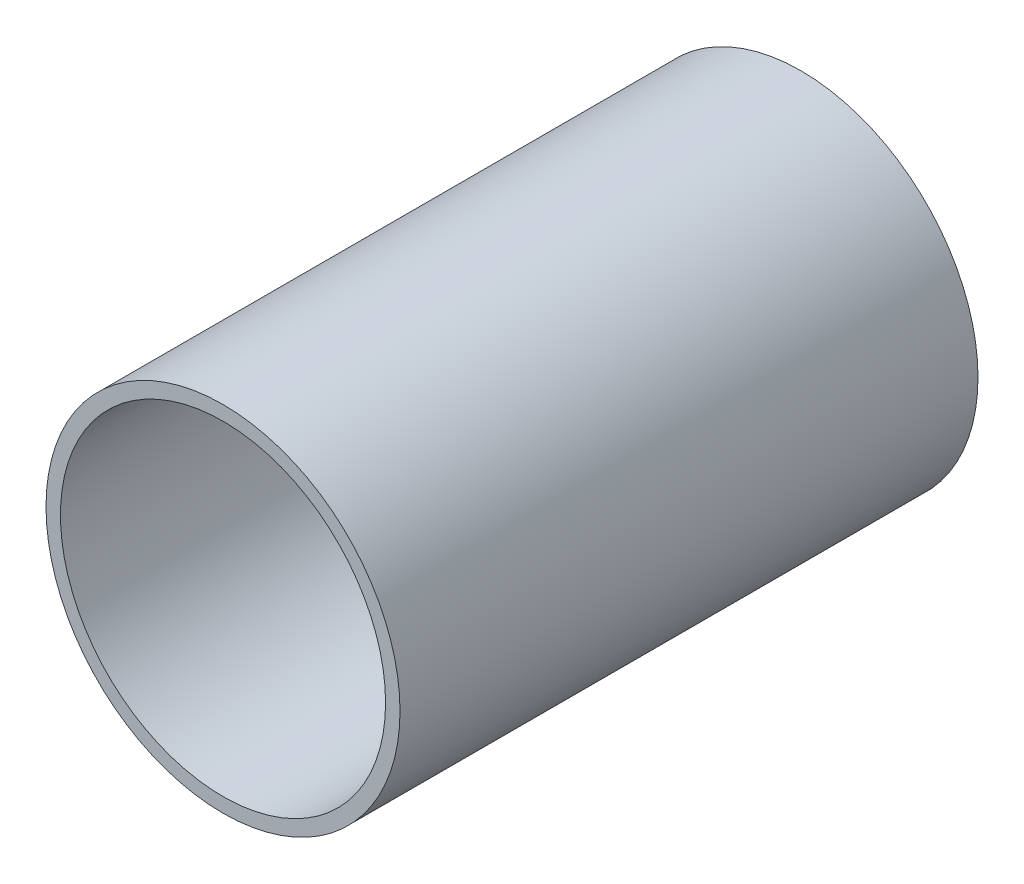
ISO-10303-21;
HEADER;
FILE_DESCRIPTION(('STEP AP214'),'2;1');
FILE_NAME('part.step','',(''),(''),'','','');
FILE_SCHEMA(('AUTOMOTIVE_DESIGN { 1 0 10303 214 1 1 1 1 }'));
ENDSEC;
DATA;
#1=APPLICATION_CONTEXT('core data for automotive mechanical design processes');
#2=APPLICATION_PROTOCOL_DEFINITION('international standard','automotive_design',2000,#1);
#3=PRODUCT_CONTEXT('',#1,'mechanical');
#4=PRODUCT('Part','Part','',(#3));
#5=PRODUCT_RELATED_PRODUCT_CATEGORY('part','',(#4));
#6=PRODUCT_DEFINITION_FORMATION('','',#4);
#7=PRODUCT_DEFINITION_CONTEXT('part definition',#1,'design');
#8=PRODUCT_DEFINITION('design','',#6,#7);
#9=PRODUCT_DEFINITION_SHAPE('','',#8);
#10=(LENGTH_UNIT() NAMED_UNIT(*) SI_UNIT(.MILLI.,.METRE.));
#11=(NAMED_UNIT(*) PLANE_ANGLE_UNIT() SI_UNIT($,.RADIAN.));
#12=(NAMED_UNIT(*) SI_UNIT($,.STERADIAN.) SOLID_ANGLE_UNIT());
#13=UNCERTAINTY_MEASURE_WITH_UNIT(LENGTH_MEASURE(1.E-05),#10,'distance_accuracy_value','');
#14=(GEOMETRIC_REPRESENTATION_CONTEXT(3) GLOBAL_UNCERTAINTY_ASSIGNED_CONTEXT((#13)) GLOBAL_UNIT_ASSIGNED_CONTEXT((#10,
#11,#12)) REPRESENTATION_CONTEXT('',''));
#15=CARTESIAN_POINT('',(0.,0.,0.));
#16=DIRECTION('',(0.,0.,1.));
#17=DIRECTION('',(1.,0.,0.));
#18=AXIS2_PLACEMENT_3D('',#15,#16,#17);
#19=CARTESIAN_POINT('',(11.1125,-19.05,25.4));
#20=DIRECTION('',(0.,0.,1.));
#21=DIRECTION('',(1.,0.,0.));
#22=AXIS2_PLACEMENT_3D('',#19,#20,#21);
#23=PLANE('',#22);
#24=CARTESIAN_POINT('',(11.1125,-19.05,25.4));
#25=DIRECTION('',(0.,0.,1.));
#26=DIRECTION('',(1.,0.,0.));
#27=AXIS2_PLACEMENT_3D('',#24,#25,#26);
#28=CIRCLE('',#27,15.5575);
#29=CARTESIAN_POINT('',(26.67,-19.05,25.4));
#30=VERTEX_POINT('',#29);
#31=EDGE_CURVE('E10',#30,#30,#28,.T.);
#32=ORIENTED_EDGE('',*,*,#31,.T.);
#33=EDGE_LOOP('',(#32));
#34=FACE_BOUND('',#33,.T.);
#35=CARTESIAN_POINT('',(11.1125,-19.05,25.4));
#36=DIRECTION('',(0.,0.,1.));
#37=DIRECTION('',(1.,0.,0.));
#38=AXIS2_PLACEMENT_3D('',#35,#36,#37);
#39=CIRCLE('',#38,14.2875);
#40=CARTESIAN_POINT('',(25.4,-19.05,25.4));
#41=VERTEX_POINT('',#40);
#42=EDGE_CURVE('E54',#41,#41,#39,.T.);
#43=ORIENTED_EDGE('',*,*,#42,.F.);
#44=EDGE_LOOP('',(#43));
#45=FACE_BOUND('',#44,.T.);
#46=ADVANCED_FACE('F41',(#34,#45),#23,.T.);
#47=CARTESIAN_POINT('',(11.1125,-19.05,-25.4));
#48=DIRECTION('',(0.,0.,1.));
#49=DIRECTION('',(1.,0.,0.));
#50=AXIS2_PLACEMENT_3D('',#47,#48,#49);
#51=PLANE('',#50);
#52=CARTESIAN_POINT('',(11.1125,-19.05,-25.4));
#53=DIRECTION('',(0.,0.,1.));
#54=DIRECTION('',(1.,0.,0.));
#55=AXIS2_PLACEMENT_3D('',#52,#53,#54);
#56=CIRCLE('',#55,15.5575);
#57=CARTESIAN_POINT('',(26.67,-19.05,-25.4));
#58=VERTEX_POINT('',#57);
#59=EDGE_CURVE('E45',#58,#58,#56,.T.);
#60=ORIENTED_EDGE('',*,*,#59,.F.);
#61=EDGE_LOOP('',(#60));
#62=FACE_BOUND('',#61,.T.);
#63=CARTESIAN_POINT('',(11.1125,-19.05,-25.4));
#64=DIRECTION('',(0.,0.,1.));
#65=DIRECTION('',(1.,0.,0.));
#66=AXIS2_PLACEMENT_3D('',#63,#64,#65);
#67=CIRCLE('',#66,14.2875);
#68=CARTESIAN_POINT('',(25.4,-19.05,-25.4));
#69=VERTEX_POINT('',#68);
#70=EDGE_CURVE('E56',#69,#69,#67,.T.);
#71=ORIENTED_EDGE('',*,*,#70,.T.);
#72=EDGE_LOOP('',(#71));
#73=FACE_BOUND('',#72,.T.);
#74=ADVANCED_FACE('F68',(#62,#73),#51,.F.);
#75=CARTESIAN_POINT('',(11.1125,-19.05,25.4));
#76=DIRECTION('',(0.,0.,-1.));
#77=DIRECTION('',(-1.,0.,0.));
#78=AXIS2_PLACEMENT_3D('',#75,#76,#77);
#79=CYLINDRICAL_SURFACE('',#78,15.5575);
#80=ORIENTED_EDGE('',*,*,#31,.F.);
#81=EDGE_LOOP('',(#80));
#82=FACE_BOUND('',#81,.T.);
#83=ORIENTED_EDGE('',*,*,#59,.T.);
#84=EDGE_LOOP('',(#83));
#85=FACE_BOUND('',#84,.T.);
#86=ADVANCED_FACE('F43',(#82,#85),#79,.T.);
#87=CARTESIAN_POINT('',(11.1125,-19.05,25.4));
#88=DIRECTION('',(0.,0.,-1.));
#89=DIRECTION('',(-1.,0.,0.));
#90=AXIS2_PLACEMENT_3D('',#87,#88,#89);
#91=CYLINDRICAL_SURFACE('',#90,14.2875);
#92=ORIENTED_EDGE('',*,*,#42,.T.);
#93=EDGE_LOOP('',(#92));
#94=FACE_BOUND('',#93,.T.);
#95=ORIENTED_EDGE('',*,*,#70,.F.);
#96=EDGE_LOOP('',(#95));
#97=FACE_BOUND('',#96,.T.);
#98=ADVANCED_FACE('F64',(#94,#97),#91,.F.);
#99=CLOSED_SHELL('',(#46,#74,#86,#98));
#100=MANIFOLD_SOLID_BREP('B2',#99);
#101=ADVANCED_BREP_SHAPE_REPRESENTATION('',(#18,#100),#14);
#102=SHAPE_DEFINITION_REPRESENTATION(#9,#101);
ENDSEC;
END-ISO-10303-21;
